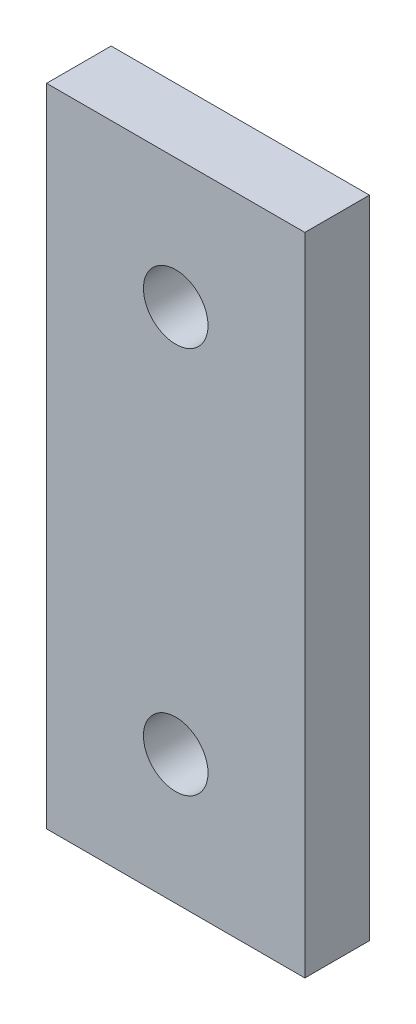
ISO-10303-21;
HEADER;
FILE_DESCRIPTION(('STEP AP214'),'2;1');
FILE_NAME('part.step','',(''),(''),'','','');
FILE_SCHEMA(('AUTOMOTIVE_DESIGN { 1 0 10303 214 1 1 1 1 }'));
ENDSEC;
DATA;
#1=APPLICATION_CONTEXT('core data for automotive mechanical design processes');
#2=APPLICATION_PROTOCOL_DEFINITION('international standard','automotive_design',2000,#1);
#3=PRODUCT_CONTEXT('',#1,'mechanical');
#4=PRODUCT('Part','Part','',(#3));
#5=PRODUCT_RELATED_PRODUCT_CATEGORY('part','',(#4));
#6=PRODUCT_DEFINITION_FORMATION('','',#4);
#7=PRODUCT_DEFINITION_CONTEXT('part definition',#1,'design');
#8=PRODUCT_DEFINITION('design','',#6,#7);
#9=PRODUCT_DEFINITION_SHAPE('','',#8);
#10=(LENGTH_UNIT() NAMED_UNIT(*) SI_UNIT(.MILLI.,.METRE.));
#11=(NAMED_UNIT(*) PLANE_ANGLE_UNIT() SI_UNIT($,.RADIAN.));
#12=(NAMED_UNIT(*) SI_UNIT($,.STERADIAN.) SOLID_ANGLE_UNIT());
#13=UNCERTAINTY_MEASURE_WITH_UNIT(LENGTH_MEASURE(1.E-05),#10,'distance_accuracy_value','');
#14=(GEOMETRIC_REPRESENTATION_CONTEXT(3) GLOBAL_UNCERTAINTY_ASSIGNED_CONTEXT((#13)) GLOBAL_UNIT_ASSIGNED_CONTEXT((#10,
#11,#12)) REPRESENTATION_CONTEXT('',''));
#15=CARTESIAN_POINT('',(0.,0.,0.));
#16=DIRECTION('',(0.,0.,1.));
#17=DIRECTION('',(1.,0.,0.));
#18=AXIS2_PLACEMENT_3D('',#15,#16,#17);
#19=CARTESIAN_POINT('',(10.,-25.,5.));
#20=DIRECTION('',(-1.,0.,0.));
#21=DIRECTION('',(0.,0.,1.));
#22=AXIS2_PLACEMENT_3D('',#19,#20,#21);
#23=PLANE('',#22);
#24=DIRECTION('',(0.,1.,0.));
#25=VECTOR('',#24,1.);
#26=CARTESIAN_POINT('',(10.,-25.,0.));
#27=LINE('',#26,#25);
#28=CARTESIAN_POINT('',(10.,-25.,0.));
#29=VERTEX_POINT('',#28);
#30=CARTESIAN_POINT('',(10.,25.,0.));
#31=VERTEX_POINT('',#30);
#32=EDGE_CURVE('E100',#29,#31,#27,.T.);
#33=ORIENTED_EDGE('',*,*,#32,.T.);
#34=DIRECTION('',(0.,0.,-1.));
#35=VECTOR('',#34,1.);
#36=CARTESIAN_POINT('',(10.,25.,5.));
#37=LINE('',#36,#35);
#38=CARTESIAN_POINT('',(10.,25.,5.));
#39=VERTEX_POINT('',#38);
#40=EDGE_CURVE('E11',#39,#31,#37,.T.);
#41=ORIENTED_EDGE('',*,*,#40,.F.);
#42=DIRECTION('',(0.,1.,0.));
#43=VECTOR('',#42,1.);
#44=CARTESIAN_POINT('',(10.,-25.,5.));
#45=LINE('',#44,#43);
#46=CARTESIAN_POINT('',(10.,-25.,5.));
#47=VERTEX_POINT('',#46);
#48=EDGE_CURVE('E88',#47,#39,#45,.T.);
#49=ORIENTED_EDGE('',*,*,#48,.F.);
#50=DIRECTION('',(0.,0.,-1.));
#51=VECTOR('',#50,1.);
#52=CARTESIAN_POINT('',(10.,-25.,5.));
#53=LINE('',#52,#51);
#54=EDGE_CURVE('E96',#47,#29,#53,.T.);
#55=ORIENTED_EDGE('',*,*,#54,.T.);
#56=EDGE_LOOP('',(#33,#41,#49,#55));
#57=FACE_BOUND('',#56,.T.);
#58=ADVANCED_FACE('F37',(#57),#23,.F.);
#59=CARTESIAN_POINT('',(-10.,25.,5.));
#60=DIRECTION('',(0.,-1.,0.));
#61=DIRECTION('',(0.,0.,-1.));
#62=AXIS2_PLACEMENT_3D('',#59,#60,#61);
#63=PLANE('',#62);
#64=DIRECTION('',(-1.,0.,0.));
#65=VECTOR('',#64,1.);
#66=CARTESIAN_POINT('',(-10.,25.,0.));
#67=LINE('',#66,#65);
#68=CARTESIAN_POINT('',(-10.,25.,0.));
#69=VERTEX_POINT('',#68);
#70=EDGE_CURVE('E92',#31,#69,#67,.T.);
#71=ORIENTED_EDGE('',*,*,#70,.T.);
#72=DIRECTION('',(0.,0.,-1.));
#73=VECTOR('',#72,1.);
#74=CARTESIAN_POINT('',(-10.,25.,5.));
#75=LINE('',#74,#73);
#76=CARTESIAN_POINT('',(-10.,25.,5.));
#77=VERTEX_POINT('',#76);
#78=EDGE_CURVE('E45',#77,#69,#75,.T.);
#79=ORIENTED_EDGE('',*,*,#78,.F.);
#80=DIRECTION('',(-1.,0.,0.));
#81=VECTOR('',#80,1.);
#82=CARTESIAN_POINT('',(-10.,25.,5.));
#83=LINE('',#82,#81);
#84=EDGE_CURVE('E83',#39,#77,#83,.T.);
#85=ORIENTED_EDGE('',*,*,#84,.F.);
#86=ORIENTED_EDGE('',*,*,#40,.T.);
#87=EDGE_LOOP('',(#71,#79,#85,#86));
#88=FACE_BOUND('',#87,.T.);
#89=ADVANCED_FACE('F91',(#88),#63,.F.);
#90=CARTESIAN_POINT('',(-10.,-25.,5.));
#91=DIRECTION('',(1.,0.,0.));
#92=DIRECTION('',(0.,0.,-1.));
#93=AXIS2_PLACEMENT_3D('',#90,#91,#92);
#94=PLANE('',#93);
#95=DIRECTION('',(0.,-1.,0.));
#96=VECTOR('',#95,1.);
#97=CARTESIAN_POINT('',(-10.,-25.,0.));
#98=LINE('',#97,#96);
#99=CARTESIAN_POINT('',(-10.,-25.,0.));
#100=VERTEX_POINT('',#99);
#101=EDGE_CURVE('E70',#69,#100,#98,.T.);
#102=ORIENTED_EDGE('',*,*,#101,.T.);
#103=DIRECTION('',(0.,0.,-1.));
#104=VECTOR('',#103,1.);
#105=CARTESIAN_POINT('',(-10.,-25.,5.));
#106=LINE('',#105,#104);
#107=CARTESIAN_POINT('',(-10.,-25.,5.));
#108=VERTEX_POINT('',#107);
#109=EDGE_CURVE('E93',#108,#100,#106,.T.);
#110=ORIENTED_EDGE('',*,*,#109,.F.);
#111=DIRECTION('',(0.,-1.,0.));
#112=VECTOR('',#111,1.);
#113=CARTESIAN_POINT('',(-10.,-25.,5.));
#114=LINE('',#113,#112);
#115=EDGE_CURVE('E86',#77,#108,#114,.T.);
#116=ORIENTED_EDGE('',*,*,#115,.F.);
#117=ORIENTED_EDGE('',*,*,#78,.T.);
#118=EDGE_LOOP('',(#102,#110,#116,#117));
#119=FACE_BOUND('',#118,.T.);
#120=ADVANCED_FACE('F94',(#119),#94,.F.);
#121=CARTESIAN_POINT('',(-10.,-25.,5.));
#122=DIRECTION('',(0.,1.,0.));
#123=DIRECTION('',(0.,0.,1.));
#124=AXIS2_PLACEMENT_3D('',#121,#122,#123);
#125=PLANE('',#124);
#126=DIRECTION('',(1.,0.,0.));
#127=VECTOR('',#126,1.);
#128=CARTESIAN_POINT('',(-10.,-25.,0.));
#129=LINE('',#128,#127);
#130=EDGE_CURVE('E76',#100,#29,#129,.T.);
#131=ORIENTED_EDGE('',*,*,#130,.T.);
#132=ORIENTED_EDGE('',*,*,#54,.F.);
#133=DIRECTION('',(1.,0.,0.));
#134=VECTOR('',#133,1.);
#135=CARTESIAN_POINT('',(-10.,-25.,5.));
#136=LINE('',#135,#134);
#137=EDGE_CURVE('E53',#108,#47,#136,.T.);
#138=ORIENTED_EDGE('',*,*,#137,.F.);
#139=ORIENTED_EDGE('',*,*,#109,.T.);
#140=EDGE_LOOP('',(#131,#132,#138,#139));
#141=FACE_BOUND('',#140,.T.);
#142=ADVANCED_FACE('F108',(#141),#125,.F.);
#143=CARTESIAN_POINT('',(0.,0.,5.));
#144=DIRECTION('',(0.,0.,-1.));
#145=DIRECTION('',(-1.,0.,0.));
#146=AXIS2_PLACEMENT_3D('',#143,#144,#145);
#147=PLANE('',#146);
#148=CARTESIAN_POINT('',(0.,15.,5.));
#149=DIRECTION('',(0.,0.,1.));
#150=DIRECTION('',(1.,0.,0.));
#151=AXIS2_PLACEMENT_3D('',#148,#149,#150);
#152=CIRCLE('',#151,2.5);
#153=CARTESIAN_POINT('',(2.5,15.,5.));
#154=VERTEX_POINT('',#153);
#155=EDGE_CURVE('E120',#154,#154,#152,.T.);
#156=ORIENTED_EDGE('',*,*,#155,.F.);
#157=EDGE_LOOP('',(#156));
#158=FACE_BOUND('',#157,.T.);
#159=CARTESIAN_POINT('',(0.,-15.,5.));
#160=DIRECTION('',(0.,0.,1.));
#161=DIRECTION('',(1.,0.,0.));
#162=AXIS2_PLACEMENT_3D('',#159,#160,#161);
#163=CIRCLE('',#162,2.5);
#164=CARTESIAN_POINT('',(2.5,-15.,5.));
#165=VERTEX_POINT('',#164);
#166=EDGE_CURVE('E114',#165,#165,#163,.T.);
#167=ORIENTED_EDGE('',*,*,#166,.F.);
#168=EDGE_LOOP('',(#167));
#169=FACE_BOUND('',#168,.T.);
#170=ORIENTED_EDGE('',*,*,#48,.T.);
#171=ORIENTED_EDGE('',*,*,#84,.T.);
#172=ORIENTED_EDGE('',*,*,#115,.T.);
#173=ORIENTED_EDGE('',*,*,#137,.T.);
#174=EDGE_LOOP('',(#170,#171,#172,#173));
#175=FACE_BOUND('',#174,.T.);
#176=ADVANCED_FACE('F84',(#158,#169,#175),#147,.F.);
#177=CARTESIAN_POINT('',(0.,0.,0.));
#178=DIRECTION('',(0.,0.,-1.));
#179=DIRECTION('',(-1.,0.,0.));
#180=AXIS2_PLACEMENT_3D('',#177,#178,#179);
#181=PLANE('',#180);
#182=CARTESIAN_POINT('',(0.,15.,0.));
#183=DIRECTION('',(0.,0.,1.));
#184=DIRECTION('',(1.,0.,0.));
#185=AXIS2_PLACEMENT_3D('',#182,#183,#184);
#186=CIRCLE('',#185,2.5);
#187=CARTESIAN_POINT('',(2.5,15.,0.));
#188=VERTEX_POINT('',#187);
#189=EDGE_CURVE('E103',#188,#188,#186,.T.);
#190=ORIENTED_EDGE('',*,*,#189,.T.);
#191=EDGE_LOOP('',(#190));
#192=FACE_BOUND('',#191,.T.);
#193=CARTESIAN_POINT('',(0.,-15.,0.));
#194=DIRECTION('',(0.,0.,1.));
#195=DIRECTION('',(1.,0.,0.));
#196=AXIS2_PLACEMENT_3D('',#193,#194,#195);
#197=CIRCLE('',#196,2.5);
#198=CARTESIAN_POINT('',(2.5,-15.,0.));
#199=VERTEX_POINT('',#198);
#200=EDGE_CURVE('E117',#199,#199,#197,.T.);
#201=ORIENTED_EDGE('',*,*,#200,.T.);
#202=EDGE_LOOP('',(#201));
#203=FACE_BOUND('',#202,.T.);
#204=ORIENTED_EDGE('',*,*,#32,.F.);
#205=ORIENTED_EDGE('',*,*,#130,.F.);
#206=ORIENTED_EDGE('',*,*,#101,.F.);
#207=ORIENTED_EDGE('',*,*,#70,.F.);
#208=EDGE_LOOP('',(#204,#205,#206,#207));
#209=FACE_BOUND('',#208,.T.);
#210=ADVANCED_FACE('F111',(#192,#203,#209),#181,.T.);
#211=CARTESIAN_POINT('',(0.,-15.,0.));
#212=DIRECTION('',(0.,0.,1.));
#213=DIRECTION('',(1.,0.,0.));
#214=AXIS2_PLACEMENT_3D('',#211,#212,#213);
#215=CYLINDRICAL_SURFACE('',#214,2.5);
#216=ORIENTED_EDGE('',*,*,#200,.F.);
#217=EDGE_LOOP('',(#216));
#218=FACE_BOUND('',#217,.T.);
#219=ORIENTED_EDGE('',*,*,#166,.T.);
#220=EDGE_LOOP('',(#219));
#221=FACE_BOUND('',#220,.T.);
#222=ADVANCED_FACE('F131',(#218,#221),#215,.F.);
#223=CARTESIAN_POINT('',(0.,15.,0.));
#224=DIRECTION('',(0.,0.,1.));
#225=DIRECTION('',(1.,0.,0.));
#226=AXIS2_PLACEMENT_3D('',#223,#224,#225);
#227=CYLINDRICAL_SURFACE('',#226,2.5);
#228=ORIENTED_EDGE('',*,*,#189,.F.);
#229=EDGE_LOOP('',(#228));
#230=FACE_BOUND('',#229,.T.);
#231=ORIENTED_EDGE('',*,*,#155,.T.);
#232=EDGE_LOOP('',(#231));
#233=FACE_BOUND('',#232,.T.);
#234=ADVANCED_FACE('F128',(#230,#233),#227,.F.);
#235=CLOSED_SHELL('',(#58,#89,#120,#142,#176,#210,#222,#234));
#236=MANIFOLD_SOLID_BREP('B2',#235);
#237=ADVANCED_BREP_SHAPE_REPRESENTATION('',(#18,#236),#14);
#238=SHAPE_DEFINITION_REPRESENTATION(#9,#237);
ENDSEC;
END-ISO-10303-21;
